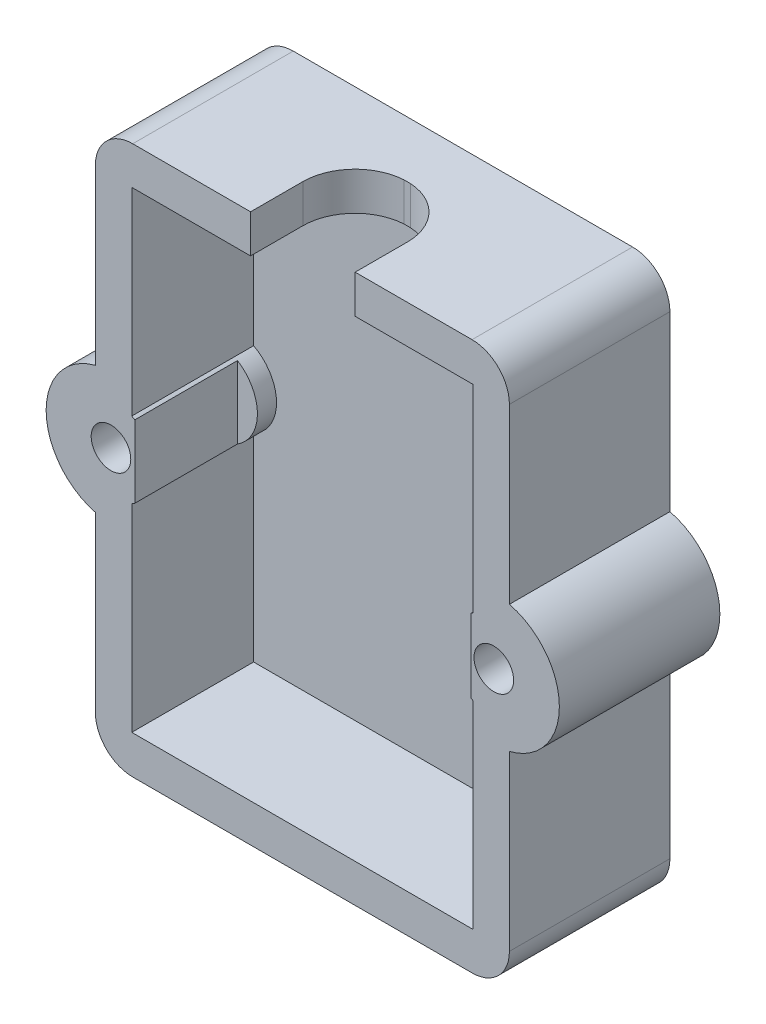
ISO-10303-21;
HEADER;
FILE_DESCRIPTION(('STEP AP214'),'2;1');
FILE_NAME('part.step','',(''),(''),'','','');
FILE_SCHEMA(('AUTOMOTIVE_DESIGN { 1 0 10303 214 1 1 1 1 }'));
ENDSEC;
DATA;
#1=APPLICATION_CONTEXT('core data for automotive mechanical design processes');
#2=APPLICATION_PROTOCOL_DEFINITION('international standard','automotive_design',2000,#1);
#3=PRODUCT_CONTEXT('',#1,'mechanical');
#4=PRODUCT('Part','Part','',(#3));
#5=PRODUCT_RELATED_PRODUCT_CATEGORY('part','',(#4));
#6=PRODUCT_DEFINITION_FORMATION('','',#4);
#7=PRODUCT_DEFINITION_CONTEXT('part definition',#1,'design');
#8=PRODUCT_DEFINITION('design','',#6,#7);
#9=PRODUCT_DEFINITION_SHAPE('','',#8);
#10=(LENGTH_UNIT() NAMED_UNIT(*) SI_UNIT(.MILLI.,.METRE.));
#11=(NAMED_UNIT(*) PLANE_ANGLE_UNIT() SI_UNIT($,.RADIAN.));
#12=(NAMED_UNIT(*) SI_UNIT($,.STERADIAN.) SOLID_ANGLE_UNIT());
#13=UNCERTAINTY_MEASURE_WITH_UNIT(LENGTH_MEASURE(1.E-05),#10,'distance_accuracy_value','');
#14=(GEOMETRIC_REPRESENTATION_CONTEXT(3) GLOBAL_UNCERTAINTY_ASSIGNED_CONTEXT((#13)) GLOBAL_UNIT_ASSIGNED_CONTEXT((#10,
#11,#12)) REPRESENTATION_CONTEXT('',''));
#15=CARTESIAN_POINT('',(0.,0.,0.));
#16=DIRECTION('',(0.,0.,1.));
#17=DIRECTION('',(1.,0.,0.));
#18=AXIS2_PLACEMENT_3D('',#15,#16,#17);
#19=CARTESIAN_POINT('',(-9.11000000000001,28.1835878256806,8.595));
#20=DIRECTION('',(0.,1.,0.));
#21=DIRECTION('',(-1.,0.,0.));
#22=AXIS2_PLACEMENT_3D('',#19,#20,#21);
#23=PLANE('',#22);
#24=CARTESIAN_POINT('',(0.,28.1835878256806,5.8));
#25=DIRECTION('',(0.,1.,0.));
#26=DIRECTION('',(0.,0.,1.));
#27=AXIS2_PLACEMENT_3D('',#24,#25,#26);
#28=CIRCLE('',#27,2.8);
#29=CARTESIAN_POINT('',(2.79999999999999,28.1835878256806,5.8));
#30=VERTEX_POINT('',#29);
#31=CARTESIAN_POINT('',(0.167257286836763,28.1835878256806,3.005));
#32=VERTEX_POINT('',#31);
#33=EDGE_CURVE('E437',#30,#32,#28,.T.);
#34=ORIENTED_EDGE('',*,*,#33,.F.);
#35=DIRECTION('',(0.,0.,1.));
#36=VECTOR('',#35,1.);
#37=CARTESIAN_POINT('',(2.79999999999999,28.1835878256806,0.));
#38=LINE('',#37,#36);
#39=CARTESIAN_POINT('',(2.79999999999999,28.1835878256806,8.595));
#40=VERTEX_POINT('',#39);
#41=EDGE_CURVE('E434',#30,#40,#38,.T.);
#42=ORIENTED_EDGE('',*,*,#41,.T.);
#43=DIRECTION('',(1.,0.,0.));
#44=VECTOR('',#43,1.);
#45=CARTESIAN_POINT('',(-9.11000000000001,28.1835878256806,8.595));
#46=LINE('',#45,#44);
#47=CARTESIAN_POINT('',(9.06,28.1835878256806,8.595));
#48=VERTEX_POINT('',#47);
#49=EDGE_CURVE('E313',#40,#48,#46,.T.);
#50=ORIENTED_EDGE('',*,*,#49,.T.);
#51=DIRECTION('',(0.,0.,-1.));
#52=VECTOR('',#51,1.);
#53=CARTESIAN_POINT('',(9.06,28.1835878256806,8.595));
#54=LINE('',#53,#52);
#55=CARTESIAN_POINT('',(9.06,28.1835878256806,0.));
#56=VERTEX_POINT('',#55);
#57=EDGE_CURVE('E398',#48,#56,#54,.T.);
#58=ORIENTED_EDGE('',*,*,#57,.T.);
#59=DIRECTION('',(1.,0.,0.));
#60=VECTOR('',#59,1.);
#61=CARTESIAN_POINT('',(-9.11000000000001,28.1835878256806,0.));
#62=LINE('',#61,#60);
#63=CARTESIAN_POINT('',(-9.11000000000001,28.1835878256806,0.));
#64=VERTEX_POINT('',#63);
#65=EDGE_CURVE('E346',#64,#56,#62,.T.);
#66=ORIENTED_EDGE('',*,*,#65,.F.);
#67=DIRECTION('',(0.,0.,-1.));
#68=VECTOR('',#67,1.);
#69=CARTESIAN_POINT('',(-9.11000000000001,28.1835878256806,8.595));
#70=LINE('',#69,#68);
#71=CARTESIAN_POINT('',(-9.11000000000001,28.1835878256806,8.595));
#72=VERTEX_POINT('',#71);
#73=EDGE_CURVE('E343',#72,#64,#70,.T.);
#74=ORIENTED_EDGE('',*,*,#73,.F.);
#75=CARTESIAN_POINT('',(-2.80000000000001,28.1835878256806,8.595));
#76=VERTEX_POINT('',#75);
#77=EDGE_CURVE('E315',#72,#76,#46,.T.);
#78=ORIENTED_EDGE('',*,*,#77,.T.);
#79=DIRECTION('',(0.,0.,1.));
#80=VECTOR('',#79,1.);
#81=CARTESIAN_POINT('',(-2.80000000000001,28.1835878256806,0.));
#82=LINE('',#81,#80);
#83=CARTESIAN_POINT('',(-2.80000000000001,28.1835878256806,5.8));
#84=VERTEX_POINT('',#83);
#85=EDGE_CURVE('E444',#84,#76,#82,.T.);
#86=ORIENTED_EDGE('',*,*,#85,.F.);
#87=CARTESIAN_POINT('',(-0.167257286836773,28.1835878256806,3.005));
#88=VERTEX_POINT('',#87);
#89=EDGE_CURVE('E441',#88,#84,#28,.T.);
#90=ORIENTED_EDGE('',*,*,#89,.F.);
#91=DIRECTION('',(1.,0.,0.));
#92=VECTOR('',#91,1.);
#93=CARTESIAN_POINT('',(0.,28.1835878256806,3.005));
#94=LINE('',#93,#92);
#95=EDGE_CURVE('E440',#88,#32,#94,.T.);
#96=ORIENTED_EDGE('',*,*,#95,.T.);
#97=EDGE_LOOP('',(#34,#42,#50,#58,#66,#74,#78,#86,#90,#96));
#98=FACE_BOUND('',#97,.T.);
#99=ADVANCED_FACE('F41',(#98),#23,.T.);
#100=CARTESIAN_POINT('',(-9.11000000000001,26.1835878256806,8.595));
#101=DIRECTION('',(0.,0.,-1.));
#102=DIRECTION('',(-1.,0.,0.));
#103=AXIS2_PLACEMENT_3D('',#100,#101,#102);
#104=PLANE('',#103);
#105=CARTESIAN_POINT('',(10.225,13.5,8.595));
#106=DIRECTION('',(0.,0.,1.));
#107=DIRECTION('',(-1.,0.,0.));
#108=AXIS2_PLACEMENT_3D('',#105,#106,#107);
#109=CIRCLE('',#108,1.06);
#110=CARTESIAN_POINT('',(9.165,13.5,8.595));
#111=VERTEX_POINT('',#110);
#112=EDGE_CURVE('E280',#111,#111,#109,.T.);
#113=ORIENTED_EDGE('',*,*,#112,.F.);
#114=EDGE_LOOP('',(#113));
#115=FACE_BOUND('',#114,.T.);
#116=CARTESIAN_POINT('',(-10.275,13.5,8.595));
#117=DIRECTION('',(0.,0.,1.));
#118=DIRECTION('',(1.,0.,0.));
#119=AXIS2_PLACEMENT_3D('',#116,#117,#118);
#120=CIRCLE('',#119,1.06);
#121=CARTESIAN_POINT('',(-9.21500000000001,13.5,8.595));
#122=VERTEX_POINT('',#121);
#123=EDGE_CURVE('E298',#122,#122,#120,.T.);
#124=ORIENTED_EDGE('',*,*,#123,.F.);
#125=EDGE_LOOP('',(#124));
#126=FACE_BOUND('',#125,.T.);
#127=CARTESIAN_POINT('',(10.175,13.5,8.595));
#128=DIRECTION('',(0.,0.,-1.));
#129=DIRECTION('',(-1.,0.,0.));
#130=AXIS2_PLACEMENT_3D('',#127,#128,#129);
#131=CIRCLE('',#130,2.28997905235349);
#132=CARTESIAN_POINT('',(9.,15.4655480305039,8.595));
#133=VERTEX_POINT('',#132);
#134=CARTESIAN_POINT('',(9.1125,15.528570385818,8.595));
#135=VERTEX_POINT('',#134);
#136=EDGE_CURVE('E255',#133,#135,#131,.T.);
#137=ORIENTED_EDGE('',*,*,#136,.F.);
#138=DIRECTION('',(0.,1.,0.));
#139=VECTOR('',#138,1.);
#140=CARTESIAN_POINT('',(9.,1.22331959556489,8.595));
#141=LINE('',#140,#139);
#142=CARTESIAN_POINT('',(9.,11.5344519694961,8.595));
#143=VERTEX_POINT('',#142);
#144=EDGE_CURVE('E240',#143,#133,#141,.T.);
#145=ORIENTED_EDGE('',*,*,#144,.F.);
#146=CARTESIAN_POINT('',(9.1125,11.471429614182,8.595));
#147=VERTEX_POINT('',#146);
#148=EDGE_CURVE('E253',#147,#143,#131,.T.);
#149=ORIENTED_EDGE('',*,*,#148,.F.);
#150=DIRECTION('',(0.,1.,0.));
#151=VECTOR('',#150,1.);
#152=CARTESIAN_POINT('',(9.1125,0.861412174319438,8.595));
#153=LINE('',#152,#151);
#154=CARTESIAN_POINT('',(9.1125,0.861412174319438,8.595));
#155=VERTEX_POINT('',#154);
#156=EDGE_CURVE('E267',#155,#147,#153,.T.);
#157=ORIENTED_EDGE('',*,*,#156,.F.);
#158=DIRECTION('',(1.,0.,0.));
#159=VECTOR('',#158,1.);
#160=CARTESIAN_POINT('',(-9.1625,0.861412174319438,8.595));
#161=LINE('',#160,#159);
#162=CARTESIAN_POINT('',(-9.1625,0.861412174319438,8.595));
#163=VERTEX_POINT('',#162);
#164=EDGE_CURVE('E487',#163,#155,#161,.T.);
#165=ORIENTED_EDGE('',*,*,#164,.F.);
#166=DIRECTION('',(0.,-1.,0.));
#167=VECTOR('',#166,1.);
#168=CARTESIAN_POINT('',(-9.1625,0.861412174319438,8.595));
#169=LINE('',#168,#167);
#170=CARTESIAN_POINT('',(-9.1625,11.471429614182,8.595));
#171=VERTEX_POINT('',#170);
#172=EDGE_CURVE('E485',#171,#163,#169,.T.);
#173=ORIENTED_EDGE('',*,*,#172,.F.);
#174=CARTESIAN_POINT('',(-10.225,13.5,8.595));
#175=DIRECTION('',(0.,0.,-1.));
#176=DIRECTION('',(1.,0.,0.));
#177=AXIS2_PLACEMENT_3D('',#174,#175,#176);
#178=CIRCLE('',#177,2.28997905235349);
#179=CARTESIAN_POINT('',(-9.,11.565218601439,8.595));
#180=VERTEX_POINT('',#179);
#181=EDGE_CURVE('E416',#180,#171,#178,.T.);
#182=ORIENTED_EDGE('',*,*,#181,.F.);
#183=DIRECTION('',(0.,-1.,0.));
#184=VECTOR('',#183,1.);
#185=CARTESIAN_POINT('',(-9.,1.22331959556489,8.595));
#186=LINE('',#185,#184);
#187=CARTESIAN_POINT('',(-9.,15.434781398561,8.595));
#188=VERTEX_POINT('',#187);
#189=EDGE_CURVE('E256',#188,#180,#186,.T.);
#190=ORIENTED_EDGE('',*,*,#189,.F.);
#191=CARTESIAN_POINT('',(-9.1625,15.528570385818,8.595));
#192=VERTEX_POINT('',#191);
#193=EDGE_CURVE('E409',#192,#188,#178,.T.);
#194=ORIENTED_EDGE('',*,*,#193,.F.);
#195=DIRECTION('',(0.,-1.,0.));
#196=VECTOR('',#195,1.);
#197=CARTESIAN_POINT('',(-9.1625,15.528570385818,8.595));
#198=LINE('',#197,#196);
#199=CARTESIAN_POINT('',(-9.1625,26.1364121743194,8.595));
#200=VERTEX_POINT('',#199);
#201=EDGE_CURVE('E274',#200,#192,#198,.T.);
#202=ORIENTED_EDGE('',*,*,#201,.F.);
#203=DIRECTION('',(-1.,0.,0.));
#204=VECTOR('',#203,1.);
#205=CARTESIAN_POINT('',(-9.1625,26.1364121743194,8.595));
#206=LINE('',#205,#204);
#207=CARTESIAN_POINT('',(-2.80000000000001,26.1364121743194,8.595));
#208=VERTEX_POINT('',#207);
#209=EDGE_CURVE('E265',#208,#200,#206,.T.);
#210=ORIENTED_EDGE('',*,*,#209,.F.);
#211=DIRECTION('',(0.,1.,0.));
#212=VECTOR('',#211,1.);
#213=CARTESIAN_POINT('',(-2.80000000000001,-1.18458782568056,8.595));
#214=LINE('',#213,#212);
#215=EDGE_CURVE('E450',#208,#76,#214,.T.);
#216=ORIENTED_EDGE('',*,*,#215,.T.);
#217=ORIENTED_EDGE('',*,*,#77,.F.);
#218=CARTESIAN_POINT('',(-9.11000000000001,26.1835878256806,8.595));
#219=DIRECTION('',(0.,0.,-1.));
#220=DIRECTION('',(-1.,0.,0.));
#221=AXIS2_PLACEMENT_3D('',#218,#219,#220);
#222=CIRCLE('',#221,2.);
#223=CARTESIAN_POINT('',(-11.11,26.1835878256806,8.595));
#224=VERTEX_POINT('',#223);
#225=EDGE_CURVE('E310',#224,#72,#222,.T.);
#226=ORIENTED_EDGE('',*,*,#225,.F.);
#227=DIRECTION('',(0.,1.,0.));
#228=VECTOR('',#227,1.);
#229=CARTESIAN_POINT('',(-11.11,16.9092337848848,8.595));
#230=LINE('',#229,#228);
#231=CARTESIAN_POINT('',(-11.11,16.9092337848848,8.595));
#232=VERTEX_POINT('',#231);
#233=EDGE_CURVE('E340',#232,#224,#230,.T.);
#234=ORIENTED_EDGE('',*,*,#233,.F.);
#235=CARTESIAN_POINT('',(-10.225,13.5,8.595));
#236=DIRECTION('',(0.,0.,1.));
#237=DIRECTION('',(1.,0.,0.));
#238=AXIS2_PLACEMENT_3D('',#235,#236,#237);
#239=CIRCLE('',#238,3.52222940763375);
#240=CARTESIAN_POINT('',(-11.11,10.0907662151152,8.595));
#241=VERTEX_POINT('',#240);
#242=EDGE_CURVE('E338',#232,#241,#239,.T.);
#243=ORIENTED_EDGE('',*,*,#242,.T.);
#244=DIRECTION('',(0.,1.,0.));
#245=VECTOR('',#244,1.);
#246=CARTESIAN_POINT('',(-11.11,0.816412174319438,8.595));
#247=LINE('',#246,#245);
#248=CARTESIAN_POINT('',(-11.11,0.816412174319438,8.595));
#249=VERTEX_POINT('',#248);
#250=EDGE_CURVE('E335',#249,#241,#247,.T.);
#251=ORIENTED_EDGE('',*,*,#250,.F.);
#252=CARTESIAN_POINT('',(-9.11,0.816412174319438,8.595));
#253=DIRECTION('',(0.,0.,1.));
#254=DIRECTION('',(1.,0.,0.));
#255=AXIS2_PLACEMENT_3D('',#252,#253,#254);
#256=CIRCLE('',#255,2.);
#257=CARTESIAN_POINT('',(-9.11,-1.18358782568056,8.595));
#258=VERTEX_POINT('',#257);
#259=EDGE_CURVE('E333',#249,#258,#256,.T.);
#260=ORIENTED_EDGE('',*,*,#259,.T.);
#261=DIRECTION('',(1.,0.,0.));
#262=VECTOR('',#261,1.);
#263=CARTESIAN_POINT('',(-9.11,-1.18358782568056,8.595));
#264=LINE('',#263,#262);
#265=CARTESIAN_POINT('',(9.06,-1.18358782568056,8.595));
#266=VERTEX_POINT('',#265);
#267=EDGE_CURVE('E331',#258,#266,#264,.T.);
#268=ORIENTED_EDGE('',*,*,#267,.T.);
#269=CARTESIAN_POINT('',(9.06,0.816412174319441,8.595));
#270=DIRECTION('',(0.,0.,-1.));
#271=DIRECTION('',(-1.,0.,0.));
#272=AXIS2_PLACEMENT_3D('',#269,#270,#271);
#273=CIRCLE('',#272,2.);
#274=CARTESIAN_POINT('',(11.06,0.816412174319441,8.595));
#275=VERTEX_POINT('',#274);
#276=EDGE_CURVE('E328',#275,#266,#273,.T.);
#277=ORIENTED_EDGE('',*,*,#276,.F.);
#278=DIRECTION('',(0.,1.,0.));
#279=VECTOR('',#278,1.);
#280=CARTESIAN_POINT('',(11.06,0.816412174319441,8.595));
#281=LINE('',#280,#279);
#282=CARTESIAN_POINT('',(11.06,10.0907662151152,8.595));
#283=VERTEX_POINT('',#282);
#284=EDGE_CURVE('E326',#275,#283,#281,.T.);
#285=ORIENTED_EDGE('',*,*,#284,.T.);
#286=CARTESIAN_POINT('',(10.225,13.5,8.595));
#287=DIRECTION('',(0.,0.,-1.));
#288=DIRECTION('',(-1.,0.,0.));
#289=AXIS2_PLACEMENT_3D('',#286,#287,#288);
#290=CIRCLE('',#289,3.51000000000001);
#291=CARTESIAN_POINT('',(11.06,16.9092337848848,8.595));
#292=VERTEX_POINT('',#291);
#293=EDGE_CURVE('E323',#292,#283,#290,.T.);
#294=ORIENTED_EDGE('',*,*,#293,.F.);
#295=DIRECTION('',(0.,1.,0.));
#296=VECTOR('',#295,1.);
#297=CARTESIAN_POINT('',(11.06,16.9092337848848,8.595));
#298=LINE('',#297,#296);
#299=CARTESIAN_POINT('',(11.06,26.1835878256806,8.595));
#300=VERTEX_POINT('',#299);
#301=EDGE_CURVE('E321',#292,#300,#298,.T.);
#302=ORIENTED_EDGE('',*,*,#301,.T.);
#303=CARTESIAN_POINT('',(9.06,26.1835878256806,8.595));
#304=DIRECTION('',(0.,0.,-1.));
#305=DIRECTION('',(-1.,0.,0.));
#306=AXIS2_PLACEMENT_3D('',#303,#304,#305);
#307=CIRCLE('',#306,2.);
#308=EDGE_CURVE('E318',#48,#300,#307,.T.);
#309=ORIENTED_EDGE('',*,*,#308,.F.);
#310=ORIENTED_EDGE('',*,*,#49,.F.);
#311=DIRECTION('',(0.,1.,0.));
#312=VECTOR('',#311,1.);
#313=CARTESIAN_POINT('',(2.79999999999999,-1.18458782568056,8.595));
#314=LINE('',#313,#312);
#315=CARTESIAN_POINT('',(2.79999999999999,26.1364121743194,8.595));
#316=VERTEX_POINT('',#315);
#317=EDGE_CURVE('E447',#316,#40,#314,.T.);
#318=ORIENTED_EDGE('',*,*,#317,.F.);
#319=CARTESIAN_POINT('',(9.1125,26.1364121743194,8.595));
#320=VERTEX_POINT('',#319);
#321=EDGE_CURVE('E271',#320,#316,#206,.T.);
#322=ORIENTED_EDGE('',*,*,#321,.F.);
#323=DIRECTION('',(0.,1.,0.));
#324=VECTOR('',#323,1.);
#325=CARTESIAN_POINT('',(9.1125,15.528570385818,8.595));
#326=LINE('',#325,#324);
#327=EDGE_CURVE('E262',#135,#320,#326,.T.);
#328=ORIENTED_EDGE('',*,*,#327,.F.);
#329=EDGE_LOOP('',(#137,#145,#149,#157,#165,#173,#182,#190,#194,#202,#210,#216,#217,#226,#234,
#243,#251,#260,#268,#277,#285,#294,#302,#309,#310,#318,#322,#328));
#330=FACE_BOUND('',#329,.T.);
#331=ADVANCED_FACE('F251',(#115,#126,#330),#104,.F.);
#332=CARTESIAN_POINT('',(-9.1625,26.1364121743194,2.07));
#333=DIRECTION('',(0.,1.,0.));
#334=DIRECTION('',(0.,0.,1.));
#335=AXIS2_PLACEMENT_3D('',#332,#333,#334);
#336=PLANE('',#335);
#337=DIRECTION('',(0.,0.,-1.));
#338=VECTOR('',#337,1.);
#339=CARTESIAN_POINT('',(2.79999999999999,26.1364121743194,0.));
#340=LINE('',#339,#338);
#341=CARTESIAN_POINT('',(2.79999999999999,26.1364121743194,5.8));
#342=VERTEX_POINT('',#341);
#343=EDGE_CURVE('E431',#316,#342,#340,.T.);
#344=ORIENTED_EDGE('',*,*,#343,.T.);
#345=CARTESIAN_POINT('',(0.,26.1364121743194,5.8));
#346=DIRECTION('',(0.,1.,0.));
#347=DIRECTION('',(0.,0.,1.));
#348=AXIS2_PLACEMENT_3D('',#345,#346,#347);
#349=CIRCLE('',#348,2.8);
#350=CARTESIAN_POINT('',(0.167257286836763,26.1364121743194,3.005));
#351=VERTEX_POINT('',#350);
#352=EDGE_CURVE('E449',#351,#342,#349,.F.);
#353=ORIENTED_EDGE('',*,*,#352,.F.);
#354=DIRECTION('',(-1.,0.,0.));
#355=VECTOR('',#354,1.);
#356=CARTESIAN_POINT('',(0.,26.1364121743194,3.005));
#357=LINE('',#356,#355);
#358=CARTESIAN_POINT('',(-0.167257286836773,26.1364121743194,3.005));
#359=VERTEX_POINT('',#358);
#360=EDGE_CURVE('E422',#351,#359,#357,.T.);
#361=ORIENTED_EDGE('',*,*,#360,.T.);
#362=CARTESIAN_POINT('',(0.,26.1364121743194,5.8));
#363=DIRECTION('',(0.,1.,0.));
#364=DIRECTION('',(0.,0.,1.));
#365=AXIS2_PLACEMENT_3D('',#362,#363,#364);
#366=CIRCLE('',#365,2.8);
#367=CARTESIAN_POINT('',(-2.80000000000001,26.1364121743194,5.8));
#368=VERTEX_POINT('',#367);
#369=EDGE_CURVE('E425',#368,#359,#366,.F.);
#370=ORIENTED_EDGE('',*,*,#369,.F.);
#371=DIRECTION('',(0.,0.,-1.));
#372=VECTOR('',#371,1.);
#373=CARTESIAN_POINT('',(-2.80000000000001,26.1364121743194,0.));
#374=LINE('',#373,#372);
#375=EDGE_CURVE('E428',#208,#368,#374,.T.);
#376=ORIENTED_EDGE('',*,*,#375,.F.);
#377=ORIENTED_EDGE('',*,*,#209,.T.);
#378=DIRECTION('',(0.,0.,1.));
#379=VECTOR('',#378,1.);
#380=CARTESIAN_POINT('',(-9.1625,26.1364121743194,2.07));
#381=LINE('',#380,#379);
#382=CARTESIAN_POINT('',(-9.1625,26.1364121743194,2.07));
#383=VERTEX_POINT('',#382);
#384=EDGE_CURVE('E281',#383,#200,#381,.T.);
#385=ORIENTED_EDGE('',*,*,#384,.F.);
#386=DIRECTION('',(-1.,0.,0.));
#387=VECTOR('',#386,1.);
#388=CARTESIAN_POINT('',(-9.1625,26.1364121743194,2.07));
#389=LINE('',#388,#387);
#390=CARTESIAN_POINT('',(9.1125,26.1364121743194,2.07));
#391=VERTEX_POINT('',#390);
#392=EDGE_CURVE('E479',#391,#383,#389,.T.);
#393=ORIENTED_EDGE('',*,*,#392,.F.);
#394=DIRECTION('',(0.,0.,1.));
#395=VECTOR('',#394,1.);
#396=CARTESIAN_POINT('',(9.1125,26.1364121743194,2.07));
#397=LINE('',#396,#395);
#398=EDGE_CURVE('E284',#391,#320,#397,.T.);
#399=ORIENTED_EDGE('',*,*,#398,.T.);
#400=ORIENTED_EDGE('',*,*,#321,.T.);
#401=EDGE_LOOP('',(#344,#353,#361,#370,#376,#377,#385,#393,#399,#400));
#402=FACE_BOUND('',#401,.T.);
#403=ADVANCED_FACE('F509',(#402),#336,.F.);
#404=CARTESIAN_POINT('',(-9.11000000000001,26.1835878256806,8.595));
#405=DIRECTION('',(0.,0.,-1.));
#406=DIRECTION('',(-1.,0.,0.));
#407=AXIS2_PLACEMENT_3D('',#404,#405,#406);
#408=CYLINDRICAL_SURFACE('',#407,2.);
#409=CARTESIAN_POINT('',(-9.11000000000001,26.1835878256806,0.));
#410=DIRECTION('',(0.,0.,-1.));
#411=DIRECTION('',(-1.,0.,0.));
#412=AXIS2_PLACEMENT_3D('',#409,#410,#411);
#413=CIRCLE('',#412,2.);
#414=CARTESIAN_POINT('',(-11.11,26.1835878256806,0.));
#415=VERTEX_POINT('',#414);
#416=EDGE_CURVE('E301',#415,#64,#413,.T.);
#417=ORIENTED_EDGE('',*,*,#416,.F.);
#418=DIRECTION('',(0.,0.,-1.));
#419=VECTOR('',#418,1.);
#420=CARTESIAN_POINT('',(-11.11,26.1835878256806,8.595));
#421=LINE('',#420,#419);
#422=EDGE_CURVE('E377',#224,#415,#421,.T.);
#423=ORIENTED_EDGE('',*,*,#422,.F.);
#424=ORIENTED_EDGE('',*,*,#225,.T.);
#425=ORIENTED_EDGE('',*,*,#73,.T.);
#426=EDGE_LOOP('',(#417,#423,#424,#425));
#427=FACE_BOUND('',#426,.T.);
#428=ADVANCED_FACE('F43',(#427),#408,.T.);
#429=CARTESIAN_POINT('',(-11.11,16.9092337848848,8.595));
#430=DIRECTION('',(-1.,0.,0.));
#431=DIRECTION('',(0.,-1.,0.));
#432=AXIS2_PLACEMENT_3D('',#429,#430,#431);
#433=PLANE('',#432);
#434=DIRECTION('',(0.,1.,0.));
#435=VECTOR('',#434,1.);
#436=CARTESIAN_POINT('',(-11.11,16.9092337848848,0.));
#437=LINE('',#436,#435);
#438=CARTESIAN_POINT('',(-11.11,16.9092337848848,0.));
#439=VERTEX_POINT('',#438);
#440=EDGE_CURVE('E314',#439,#415,#437,.T.);
#441=ORIENTED_EDGE('',*,*,#440,.F.);
#442=DIRECTION('',(0.,0.,-1.));
#443=VECTOR('',#442,1.);
#444=CARTESIAN_POINT('',(-11.11,16.9092337848848,8.595));
#445=LINE('',#444,#443);
#446=EDGE_CURVE('E379',#232,#439,#445,.T.);
#447=ORIENTED_EDGE('',*,*,#446,.F.);
#448=ORIENTED_EDGE('',*,*,#233,.T.);
#449=ORIENTED_EDGE('',*,*,#422,.T.);
#450=EDGE_LOOP('',(#441,#447,#448,#449));
#451=FACE_BOUND('',#450,.T.);
#452=ADVANCED_FACE('F525',(#451),#433,.T.);
#453=CARTESIAN_POINT('',(-10.225,13.5,8.595));
#454=DIRECTION('',(0.,0.,-1.));
#455=DIRECTION('',(-1.,0.,0.));
#456=AXIS2_PLACEMENT_3D('',#453,#454,#455);
#457=CYLINDRICAL_SURFACE('',#456,3.52222940763375);
#458=CARTESIAN_POINT('',(-10.225,13.5,0.));
#459=DIRECTION('',(0.,0.,1.));
#460=DIRECTION('',(1.,0.,0.));
#461=AXIS2_PLACEMENT_3D('',#458,#459,#460);
#462=CIRCLE('',#461,3.52222940763375);
#463=CARTESIAN_POINT('',(-11.11,10.0907662151152,0.));
#464=VERTEX_POINT('',#463);
#465=EDGE_CURVE('E372',#439,#464,#462,.T.);
#466=ORIENTED_EDGE('',*,*,#465,.T.);
#467=DIRECTION('',(0.,0.,-1.));
#468=VECTOR('',#467,1.);
#469=CARTESIAN_POINT('',(-11.11,10.0907662151152,8.595));
#470=LINE('',#469,#468);
#471=EDGE_CURVE('E381',#241,#464,#470,.T.);
#472=ORIENTED_EDGE('',*,*,#471,.F.);
#473=ORIENTED_EDGE('',*,*,#242,.F.);
#474=ORIENTED_EDGE('',*,*,#446,.T.);
#475=EDGE_LOOP('',(#466,#472,#473,#474));
#476=FACE_BOUND('',#475,.T.);
#477=ADVANCED_FACE('F530',(#476),#457,.T.);
#478=CARTESIAN_POINT('',(-11.11,0.816412174319438,8.595));
#479=DIRECTION('',(-1.,0.,0.));
#480=DIRECTION('',(0.,-1.,0.));
#481=AXIS2_PLACEMENT_3D('',#478,#479,#480);
#482=PLANE('',#481);
#483=DIRECTION('',(0.,1.,0.));
#484=VECTOR('',#483,1.);
#485=CARTESIAN_POINT('',(-11.11,0.816412174319438,0.));
#486=LINE('',#485,#484);
#487=CARTESIAN_POINT('',(-11.11,0.816412174319438,0.));
#488=VERTEX_POINT('',#487);
#489=EDGE_CURVE('E369',#488,#464,#486,.T.);
#490=ORIENTED_EDGE('',*,*,#489,.F.);
#491=DIRECTION('',(0.,0.,-1.));
#492=VECTOR('',#491,1.);
#493=CARTESIAN_POINT('',(-11.11,0.816412174319438,8.595));
#494=LINE('',#493,#492);
#495=EDGE_CURVE('E383',#249,#488,#494,.T.);
#496=ORIENTED_EDGE('',*,*,#495,.F.);
#497=ORIENTED_EDGE('',*,*,#250,.T.);
#498=ORIENTED_EDGE('',*,*,#471,.T.);
#499=EDGE_LOOP('',(#490,#496,#497,#498));
#500=FACE_BOUND('',#499,.T.);
#501=ADVANCED_FACE('F534',(#500),#482,.T.);
#502=CARTESIAN_POINT('',(-9.11,0.816412174319438,8.595));
#503=DIRECTION('',(0.,0.,-1.));
#504=DIRECTION('',(-1.,0.,0.));
#505=AXIS2_PLACEMENT_3D('',#502,#503,#504);
#506=CYLINDRICAL_SURFACE('',#505,2.);
#507=CARTESIAN_POINT('',(-9.11,0.816412174319438,0.));
#508=DIRECTION('',(0.,0.,1.));
#509=DIRECTION('',(1.,0.,0.));
#510=AXIS2_PLACEMENT_3D('',#507,#508,#509);
#511=CIRCLE('',#510,2.);
#512=CARTESIAN_POINT('',(-9.11,-1.18358782568056,0.));
#513=VERTEX_POINT('',#512);
#514=EDGE_CURVE('E367',#488,#513,#511,.T.);
#515=ORIENTED_EDGE('',*,*,#514,.T.);
#516=DIRECTION('',(0.,0.,-1.));
#517=VECTOR('',#516,1.);
#518=CARTESIAN_POINT('',(-9.11,-1.18358782568056,8.595));
#519=LINE('',#518,#517);
#520=EDGE_CURVE('E385',#258,#513,#519,.T.);
#521=ORIENTED_EDGE('',*,*,#520,.F.);
#522=ORIENTED_EDGE('',*,*,#259,.F.);
#523=ORIENTED_EDGE('',*,*,#495,.T.);
#524=EDGE_LOOP('',(#515,#521,#522,#523));
#525=FACE_BOUND('',#524,.T.);
#526=ADVANCED_FACE('F539',(#525),#506,.T.);
#527=CARTESIAN_POINT('',(-9.11,-1.18358782568056,8.595));
#528=DIRECTION('',(0.,1.,0.));
#529=DIRECTION('',(-1.,0.,0.));
#530=AXIS2_PLACEMENT_3D('',#527,#528,#529);
#531=PLANE('',#530);
#532=DIRECTION('',(1.,0.,0.));
#533=VECTOR('',#532,1.);
#534=CARTESIAN_POINT('',(-9.11,-1.18358782568056,0.));
#535=LINE('',#534,#533);
#536=CARTESIAN_POINT('',(9.06,-1.18358782568056,0.));
#537=VERTEX_POINT('',#536);
#538=EDGE_CURVE('E364',#513,#537,#535,.T.);
#539=ORIENTED_EDGE('',*,*,#538,.T.);
#540=DIRECTION('',(0.,0.,-1.));
#541=VECTOR('',#540,1.);
#542=CARTESIAN_POINT('',(9.06,-1.18358782568056,8.595));
#543=LINE('',#542,#541);
#544=EDGE_CURVE('E388',#266,#537,#543,.T.);
#545=ORIENTED_EDGE('',*,*,#544,.F.);
#546=ORIENTED_EDGE('',*,*,#267,.F.);
#547=ORIENTED_EDGE('',*,*,#520,.T.);
#548=EDGE_LOOP('',(#539,#545,#546,#547));
#549=FACE_BOUND('',#548,.T.);
#550=ADVANCED_FACE('F544',(#549),#531,.F.);
#551=CARTESIAN_POINT('',(9.06,0.816412174319441,8.595));
#552=DIRECTION('',(0.,0.,-1.));
#553=DIRECTION('',(-1.,0.,0.));
#554=AXIS2_PLACEMENT_3D('',#551,#552,#553);
#555=CYLINDRICAL_SURFACE('',#554,2.);
#556=CARTESIAN_POINT('',(9.06,0.816412174319441,0.));
#557=DIRECTION('',(0.,0.,-1.));
#558=DIRECTION('',(-1.,0.,0.));
#559=AXIS2_PLACEMENT_3D('',#556,#557,#558);
#560=CIRCLE('',#559,2.);
#561=CARTESIAN_POINT('',(11.06,0.816412174319441,0.));
#562=VERTEX_POINT('',#561);
#563=EDGE_CURVE('E361',#562,#537,#560,.T.);
#564=ORIENTED_EDGE('',*,*,#563,.F.);
#565=DIRECTION('',(0.,0.,-1.));
#566=VECTOR('',#565,1.);
#567=CARTESIAN_POINT('',(11.06,0.816412174319441,8.595));
#568=LINE('',#567,#566);
#569=EDGE_CURVE('E390',#275,#562,#568,.T.);
#570=ORIENTED_EDGE('',*,*,#569,.F.);
#571=ORIENTED_EDGE('',*,*,#276,.T.);
#572=ORIENTED_EDGE('',*,*,#544,.T.);
#573=EDGE_LOOP('',(#564,#570,#571,#572));
#574=FACE_BOUND('',#573,.T.);
#575=ADVANCED_FACE('F548',(#574),#555,.T.);
#576=CARTESIAN_POINT('',(11.06,0.816412174319441,8.595));
#577=DIRECTION('',(-1.,0.,0.));
#578=DIRECTION('',(0.,-1.,0.));
#579=AXIS2_PLACEMENT_3D('',#576,#577,#578);
#580=PLANE('',#579);
#581=DIRECTION('',(0.,1.,0.));
#582=VECTOR('',#581,1.);
#583=CARTESIAN_POINT('',(11.06,0.816412174319441,0.));
#584=LINE('',#583,#582);
#585=CARTESIAN_POINT('',(11.06,10.0907662151152,0.));
#586=VERTEX_POINT('',#585);
#587=EDGE_CURVE('E358',#562,#586,#584,.T.);
#588=ORIENTED_EDGE('',*,*,#587,.T.);
#589=DIRECTION('',(0.,0.,-1.));
#590=VECTOR('',#589,1.);
#591=CARTESIAN_POINT('',(11.06,10.0907662151152,8.595));
#592=LINE('',#591,#590);
#593=EDGE_CURVE('E392',#283,#586,#592,.T.);
#594=ORIENTED_EDGE('',*,*,#593,.F.);
#595=ORIENTED_EDGE('',*,*,#284,.F.);
#596=ORIENTED_EDGE('',*,*,#569,.T.);
#597=EDGE_LOOP('',(#588,#594,#595,#596));
#598=FACE_BOUND('',#597,.T.);
#599=ADVANCED_FACE('F553',(#598),#580,.F.);
#600=CARTESIAN_POINT('',(10.225,13.5,8.595));
#601=DIRECTION('',(0.,0.,-1.));
#602=DIRECTION('',(-1.,0.,0.));
#603=AXIS2_PLACEMENT_3D('',#600,#601,#602);
#604=CYLINDRICAL_SURFACE('',#603,3.51000000000001);
#605=CARTESIAN_POINT('',(10.225,13.5,0.));
#606=DIRECTION('',(0.,0.,-1.));
#607=DIRECTION('',(-1.,0.,0.));
#608=AXIS2_PLACEMENT_3D('',#605,#606,#607);
#609=CIRCLE('',#608,3.51000000000001);
#610=CARTESIAN_POINT('',(11.06,16.9092337848848,0.));
#611=VERTEX_POINT('',#610);
#612=EDGE_CURVE('E355',#611,#586,#609,.T.);
#613=ORIENTED_EDGE('',*,*,#612,.F.);
#614=DIRECTION('',(0.,0.,-1.));
#615=VECTOR('',#614,1.);
#616=CARTESIAN_POINT('',(11.06,16.9092337848848,8.595));
#617=LINE('',#616,#615);
#618=EDGE_CURVE('E394',#292,#611,#617,.T.);
#619=ORIENTED_EDGE('',*,*,#618,.F.);
#620=ORIENTED_EDGE('',*,*,#293,.T.);
#621=ORIENTED_EDGE('',*,*,#593,.T.);
#622=EDGE_LOOP('',(#613,#619,#620,#621));
#623=FACE_BOUND('',#622,.T.);
#624=ADVANCED_FACE('F560',(#623),#604,.T.);
#625=CARTESIAN_POINT('',(11.06,16.9092337848848,8.595));
#626=DIRECTION('',(-1.,0.,0.));
#627=DIRECTION('',(0.,-1.,0.));
#628=AXIS2_PLACEMENT_3D('',#625,#626,#627);
#629=PLANE('',#628);
#630=DIRECTION('',(0.,1.,0.));
#631=VECTOR('',#630,1.);
#632=CARTESIAN_POINT('',(11.06,16.9092337848848,0.));
#633=LINE('',#632,#631);
#634=CARTESIAN_POINT('',(11.06,26.1835878256806,0.));
#635=VERTEX_POINT('',#634);
#636=EDGE_CURVE('E352',#611,#635,#633,.T.);
#637=ORIENTED_EDGE('',*,*,#636,.T.);
#638=DIRECTION('',(0.,0.,-1.));
#639=VECTOR('',#638,1.);
#640=CARTESIAN_POINT('',(11.06,26.1835878256806,8.595));
#641=LINE('',#640,#639);
#642=EDGE_CURVE('E396',#300,#635,#641,.T.);
#643=ORIENTED_EDGE('',*,*,#642,.F.);
#644=ORIENTED_EDGE('',*,*,#301,.F.);
#645=ORIENTED_EDGE('',*,*,#618,.T.);
#646=EDGE_LOOP('',(#637,#643,#644,#645));
#647=FACE_BOUND('',#646,.T.);
#648=ADVANCED_FACE('F563',(#647),#629,.F.);
#649=CARTESIAN_POINT('',(9.06,26.1835878256806,8.595));
#650=DIRECTION('',(0.,0.,-1.));
#651=DIRECTION('',(-1.,0.,0.));
#652=AXIS2_PLACEMENT_3D('',#649,#650,#651);
#653=CYLINDRICAL_SURFACE('',#652,2.);
#654=CARTESIAN_POINT('',(9.06,26.1835878256806,0.));
#655=DIRECTION('',(0.,0.,-1.));
#656=DIRECTION('',(-1.,0.,0.));
#657=AXIS2_PLACEMENT_3D('',#654,#655,#656);
#658=CIRCLE('',#657,2.);
#659=EDGE_CURVE('E349',#56,#635,#658,.T.);
#660=ORIENTED_EDGE('',*,*,#659,.F.);
#661=ORIENTED_EDGE('',*,*,#57,.F.);
#662=ORIENTED_EDGE('',*,*,#308,.T.);
#663=ORIENTED_EDGE('',*,*,#642,.T.);
#664=EDGE_LOOP('',(#660,#661,#662,#663));
#665=FACE_BOUND('',#664,.T.);
#666=ADVANCED_FACE('F567',(#665),#653,.T.);
#667=CARTESIAN_POINT('',(-9.11000000000001,26.1835878256806,0.));
#668=DIRECTION('',(0.,0.,-1.));
#669=DIRECTION('',(-1.,0.,0.));
#670=AXIS2_PLACEMENT_3D('',#667,#668,#669);
#671=PLANE('',#670);
#672=CARTESIAN_POINT('',(-10.275,13.5,0.));
#673=DIRECTION('',(0.,0.,-1.));
#674=DIRECTION('',(-1.,0.,0.));
#675=AXIS2_PLACEMENT_3D('',#672,#673,#674);
#676=CIRCLE('',#675,1.06);
#677=CARTESIAN_POINT('',(-11.335,13.5,0.));
#678=VERTEX_POINT('',#677);
#679=EDGE_CURVE('E302',#678,#678,#676,.F.);
#680=ORIENTED_EDGE('',*,*,#679,.T.);
#681=EDGE_LOOP('',(#680));
#682=FACE_BOUND('',#681,.T.);
#683=CARTESIAN_POINT('',(10.225,13.5,0.));
#684=DIRECTION('',(0.,0.,-1.));
#685=DIRECTION('',(-1.,0.,0.));
#686=AXIS2_PLACEMENT_3D('',#683,#684,#685);
#687=CIRCLE('',#686,1.06);
#688=CARTESIAN_POINT('',(9.165,13.5,0.));
#689=VERTEX_POINT('',#688);
#690=EDGE_CURVE('E305',#689,#689,#687,.F.);
#691=ORIENTED_EDGE('',*,*,#690,.T.);
#692=EDGE_LOOP('',(#691));
#693=FACE_BOUND('',#692,.T.);
#694=ORIENTED_EDGE('',*,*,#416,.T.);
#695=ORIENTED_EDGE('',*,*,#65,.T.);
#696=ORIENTED_EDGE('',*,*,#659,.T.);
#697=ORIENTED_EDGE('',*,*,#636,.F.);
#698=ORIENTED_EDGE('',*,*,#612,.T.);
#699=ORIENTED_EDGE('',*,*,#587,.F.);
#700=ORIENTED_EDGE('',*,*,#563,.T.);
#701=ORIENTED_EDGE('',*,*,#538,.F.);
#702=ORIENTED_EDGE('',*,*,#514,.F.);
#703=ORIENTED_EDGE('',*,*,#489,.T.);
#704=ORIENTED_EDGE('',*,*,#465,.F.);
#705=ORIENTED_EDGE('',*,*,#440,.T.);
#706=EDGE_LOOP('',(#694,#695,#696,#697,#698,#699,#700,#701,#702,#703,#704,#705));
#707=FACE_BOUND('',#706,.T.);
#708=ADVANCED_FACE('F606',(#682,#693,#707),#671,.T.);
#709=CARTESIAN_POINT('',(10.225,13.5,-0.000999999999999265));
#710=DIRECTION('',(0.,0.,1.));
#711=DIRECTION('',(1.,0.,0.));
#712=AXIS2_PLACEMENT_3D('',#709,#710,#711);
#713=CYLINDRICAL_SURFACE('',#712,1.06);
#714=ORIENTED_EDGE('',*,*,#690,.F.);
#715=EDGE_LOOP('',(#714));
#716=FACE_BOUND('',#715,.T.);
#717=ORIENTED_EDGE('',*,*,#112,.T.);
#718=EDGE_LOOP('',(#717));
#719=FACE_BOUND('',#718,.T.);
#720=ADVANCED_FACE('F626',(#716,#719),#713,.F.);
#721=CARTESIAN_POINT('',(-10.275,13.5,-0.000999999999999265));
#722=DIRECTION('',(0.,0.,1.));
#723=DIRECTION('',(1.,0.,0.));
#724=AXIS2_PLACEMENT_3D('',#721,#722,#723);
#725=CYLINDRICAL_SURFACE('',#724,1.06);
#726=ORIENTED_EDGE('',*,*,#679,.F.);
#727=EDGE_LOOP('',(#726));
#728=FACE_BOUND('',#727,.T.);
#729=ORIENTED_EDGE('',*,*,#123,.T.);
#730=EDGE_LOOP('',(#729));
#731=FACE_BOUND('',#730,.T.);
#732=ADVANCED_FACE('F631',(#728,#731),#725,.F.);
#733=CARTESIAN_POINT('',(-10.225,13.5,2.07));
#734=DIRECTION('',(0.,0.,1.));
#735=DIRECTION('',(1.,0.,0.));
#736=AXIS2_PLACEMENT_3D('',#733,#734,#735);
#737=CYLINDRICAL_SURFACE('',#736,2.28997905235349);
#738=CARTESIAN_POINT('',(-10.225,13.5,3.095));
#739=DIRECTION('',(0.,0.,-1.));
#740=DIRECTION('',(-1.,0.,0.));
#741=AXIS2_PLACEMENT_3D('',#738,#739,#740);
#742=CIRCLE('',#741,2.28997905235349);
#743=CARTESIAN_POINT('',(-9.,15.434781398561,3.095));
#744=VERTEX_POINT('',#743);
#745=CARTESIAN_POINT('',(-9.,11.565218601439,3.095));
#746=VERTEX_POINT('',#745);
#747=EDGE_CURVE('E407',#744,#746,#742,.T.);
#748=ORIENTED_EDGE('',*,*,#747,.T.);
#749=DIRECTION('',(0.,0.,1.));
#750=VECTOR('',#749,1.);
#751=CARTESIAN_POINT('',(-9.,11.565218601439,2.07));
#752=LINE('',#751,#750);
#753=EDGE_CURVE('E11',#746,#180,#752,.T.);
#754=ORIENTED_EDGE('',*,*,#753,.T.);
#755=ORIENTED_EDGE('',*,*,#181,.T.);
#756=DIRECTION('',(0.,0.,1.));
#757=VECTOR('',#756,1.);
#758=CARTESIAN_POINT('',(-9.1625,11.471429614182,2.07));
#759=LINE('',#758,#757);
#760=CARTESIAN_POINT('',(-9.1625,11.471429614182,2.07));
#761=VERTEX_POINT('',#760);
#762=EDGE_CURVE('E294',#761,#171,#759,.T.);
#763=ORIENTED_EDGE('',*,*,#762,.F.);
#764=CARTESIAN_POINT('',(-10.225,13.5,2.07));
#765=DIRECTION('',(0.,0.,-1.));
#766=DIRECTION('',(1.,0.,0.));
#767=AXIS2_PLACEMENT_3D('',#764,#765,#766);
#768=CIRCLE('',#767,2.28997905235349);
#769=CARTESIAN_POINT('',(-9.1625,15.528570385818,2.07));
#770=VERTEX_POINT('',#769);
#771=EDGE_CURVE('E277',#770,#761,#768,.T.);
#772=ORIENTED_EDGE('',*,*,#771,.F.);
#773=DIRECTION('',(0.,0.,1.));
#774=VECTOR('',#773,1.);
#775=CARTESIAN_POINT('',(-9.1625,15.528570385818,2.07));
#776=LINE('',#775,#774);
#777=EDGE_CURVE('E278',#770,#192,#776,.T.);
#778=ORIENTED_EDGE('',*,*,#777,.T.);
#779=ORIENTED_EDGE('',*,*,#193,.T.);
#780=DIRECTION('',(0.,0.,1.));
#781=VECTOR('',#780,1.);
#782=CARTESIAN_POINT('',(-9.,15.434781398561,2.07));
#783=LINE('',#782,#781);
#784=EDGE_CURVE('E49',#188,#744,#783,.F.);
#785=ORIENTED_EDGE('',*,*,#784,.T.);
#786=EDGE_LOOP('',(#748,#754,#755,#763,#772,#778,#779,#785));
#787=FACE_BOUND('',#786,.T.);
#788=ADVANCED_FACE('F406',(#787),#737,.T.);
#789=CARTESIAN_POINT('',(-9.1625,15.528570385818,2.07));
#790=DIRECTION('',(-1.,0.,0.));
#791=DIRECTION('',(0.,0.,1.));
#792=AXIS2_PLACEMENT_3D('',#789,#790,#791);
#793=PLANE('',#792);
#794=ORIENTED_EDGE('',*,*,#201,.T.);
#795=ORIENTED_EDGE('',*,*,#777,.F.);
#796=DIRECTION('',(0.,-1.,0.));
#797=VECTOR('',#796,1.);
#798=CARTESIAN_POINT('',(-9.1625,15.528570385818,2.07));
#799=LINE('',#798,#797);
#800=EDGE_CURVE('E297',#383,#770,#799,.T.);
#801=ORIENTED_EDGE('',*,*,#800,.F.);
#802=ORIENTED_EDGE('',*,*,#384,.T.);
#803=EDGE_LOOP('',(#794,#795,#801,#802));
#804=FACE_BOUND('',#803,.T.);
#805=ADVANCED_FACE('F504',(#804),#793,.F.);
#806=CARTESIAN_POINT('',(9.1125,15.528570385818,2.07));
#807=DIRECTION('',(1.,0.,0.));
#808=DIRECTION('',(0.,0.,-1.));
#809=AXIS2_PLACEMENT_3D('',#806,#807,#808);
#810=PLANE('',#809);
#811=ORIENTED_EDGE('',*,*,#327,.T.);
#812=ORIENTED_EDGE('',*,*,#398,.F.);
#813=DIRECTION('',(0.,1.,0.));
#814=VECTOR('',#813,1.);
#815=CARTESIAN_POINT('',(9.1125,15.528570385818,2.07));
#816=LINE('',#815,#814);
#817=CARTESIAN_POINT('',(9.1125,15.528570385818,2.07));
#818=VERTEX_POINT('',#817);
#819=EDGE_CURVE('E476',#818,#391,#816,.T.);
#820=ORIENTED_EDGE('',*,*,#819,.F.);
#821=DIRECTION('',(0.,0.,1.));
#822=VECTOR('',#821,1.);
#823=CARTESIAN_POINT('',(9.1125,15.528570385818,2.07));
#824=LINE('',#823,#822);
#825=EDGE_CURVE('E286',#818,#135,#824,.T.);
#826=ORIENTED_EDGE('',*,*,#825,.T.);
#827=EDGE_LOOP('',(#811,#812,#820,#826));
#828=FACE_BOUND('',#827,.T.);
#829=ADVANCED_FACE('F576',(#828),#810,.F.);
#830=CARTESIAN_POINT('',(10.175,13.5,2.07));
#831=DIRECTION('',(0.,0.,1.));
#832=DIRECTION('',(1.,0.,0.));
#833=AXIS2_PLACEMENT_3D('',#830,#831,#832);
#834=CYLINDRICAL_SURFACE('',#833,2.28997905235349);
#835=CARTESIAN_POINT('',(10.175,13.5,3.095));
#836=DIRECTION('',(0.,0.,-1.));
#837=DIRECTION('',(-1.,0.,0.));
#838=AXIS2_PLACEMENT_3D('',#835,#836,#837);
#839=CIRCLE('',#838,2.28997905235349);
#840=CARTESIAN_POINT('',(9.,11.5344519694961,3.095));
#841=VERTEX_POINT('',#840);
#842=CARTESIAN_POINT('',(9.,15.4655480305039,3.095));
#843=VERTEX_POINT('',#842);
#844=EDGE_CURVE('E246',#841,#843,#839,.T.);
#845=ORIENTED_EDGE('',*,*,#844,.T.);
#846=DIRECTION('',(0.,0.,1.));
#847=VECTOR('',#846,1.);
#848=CARTESIAN_POINT('',(9.,15.4655480305039,2.07));
#849=LINE('',#848,#847);
#850=EDGE_CURVE('E245',#843,#133,#849,.T.);
#851=ORIENTED_EDGE('',*,*,#850,.T.);
#852=ORIENTED_EDGE('',*,*,#136,.T.);
#853=ORIENTED_EDGE('',*,*,#825,.F.);
#854=CARTESIAN_POINT('',(10.175,13.5,2.07));
#855=DIRECTION('',(0.,0.,-1.));
#856=DIRECTION('',(-1.,0.,0.));
#857=AXIS2_PLACEMENT_3D('',#854,#855,#856);
#858=CIRCLE('',#857,2.28997905235349);
#859=CARTESIAN_POINT('',(9.1125,11.471429614182,2.07));
#860=VERTEX_POINT('',#859);
#861=EDGE_CURVE('E473',#860,#818,#858,.T.);
#862=ORIENTED_EDGE('',*,*,#861,.F.);
#863=DIRECTION('',(0.,0.,1.));
#864=VECTOR('',#863,1.);
#865=CARTESIAN_POINT('',(9.1125,11.471429614182,2.07));
#866=LINE('',#865,#864);
#867=EDGE_CURVE('E260',#860,#147,#866,.T.);
#868=ORIENTED_EDGE('',*,*,#867,.T.);
#869=ORIENTED_EDGE('',*,*,#148,.T.);
#870=DIRECTION('',(0.,0.,1.));
#871=VECTOR('',#870,1.);
#872=CARTESIAN_POINT('',(9.,11.5344519694961,2.07));
#873=LINE('',#872,#871);
#874=EDGE_CURVE('E237',#143,#841,#873,.F.);
#875=ORIENTED_EDGE('',*,*,#874,.T.);
#876=EDGE_LOOP('',(#845,#851,#852,#853,#862,#868,#869,#875));
#877=FACE_BOUND('',#876,.T.);
#878=ADVANCED_FACE('F258',(#877),#834,.T.);
#879=CARTESIAN_POINT('',(9.1125,0.861412174319438,2.07));
#880=DIRECTION('',(1.,0.,0.));
#881=DIRECTION('',(0.,0.,-1.));
#882=AXIS2_PLACEMENT_3D('',#879,#880,#881);
#883=PLANE('',#882);
#884=ORIENTED_EDGE('',*,*,#156,.T.);
#885=ORIENTED_EDGE('',*,*,#867,.F.);
#886=DIRECTION('',(0.,1.,0.));
#887=VECTOR('',#886,1.);
#888=CARTESIAN_POINT('',(9.1125,0.861412174319438,2.07));
#889=LINE('',#888,#887);
#890=CARTESIAN_POINT('',(9.1125,0.861412174319438,2.07));
#891=VERTEX_POINT('',#890);
#892=EDGE_CURVE('E470',#891,#860,#889,.T.);
#893=ORIENTED_EDGE('',*,*,#892,.F.);
#894=DIRECTION('',(0.,0.,1.));
#895=VECTOR('',#894,1.);
#896=CARTESIAN_POINT('',(9.1125,0.861412174319438,2.07));
#897=LINE('',#896,#895);
#898=EDGE_CURVE('E290',#891,#155,#897,.T.);
#899=ORIENTED_EDGE('',*,*,#898,.T.);
#900=EDGE_LOOP('',(#884,#885,#893,#899));
#901=FACE_BOUND('',#900,.T.);
#902=ADVANCED_FACE('F492',(#901),#883,.F.);
#903=CARTESIAN_POINT('',(-9.1625,0.861412174319438,2.07));
#904=DIRECTION('',(0.,-1.,0.));
#905=DIRECTION('',(0.,0.,-1.));
#906=AXIS2_PLACEMENT_3D('',#903,#904,#905);
#907=PLANE('',#906);
#908=ORIENTED_EDGE('',*,*,#164,.T.);
#909=ORIENTED_EDGE('',*,*,#898,.F.);
#910=DIRECTION('',(1.,0.,0.));
#911=VECTOR('',#910,1.);
#912=CARTESIAN_POINT('',(-9.1625,0.861412174319438,2.07));
#913=LINE('',#912,#911);
#914=CARTESIAN_POINT('',(-9.1625,0.861412174319438,2.07));
#915=VERTEX_POINT('',#914);
#916=EDGE_CURVE('E467',#915,#891,#913,.T.);
#917=ORIENTED_EDGE('',*,*,#916,.F.);
#918=DIRECTION('',(0.,0.,1.));
#919=VECTOR('',#918,1.);
#920=CARTESIAN_POINT('',(-9.1625,0.861412174319438,2.07));
#921=LINE('',#920,#919);
#922=EDGE_CURVE('E292',#915,#163,#921,.T.);
#923=ORIENTED_EDGE('',*,*,#922,.T.);
#924=EDGE_LOOP('',(#908,#909,#917,#923));
#925=FACE_BOUND('',#924,.T.);
#926=ADVANCED_FACE('F640',(#925),#907,.F.);
#927=CARTESIAN_POINT('',(-9.1625,0.861412174319438,2.07));
#928=DIRECTION('',(-1.,0.,0.));
#929=DIRECTION('',(0.,0.,1.));
#930=AXIS2_PLACEMENT_3D('',#927,#928,#929);
#931=PLANE('',#930);
#932=ORIENTED_EDGE('',*,*,#172,.T.);
#933=ORIENTED_EDGE('',*,*,#922,.F.);
#934=DIRECTION('',(0.,-1.,0.));
#935=VECTOR('',#934,1.);
#936=CARTESIAN_POINT('',(-9.1625,0.861412174319438,2.07));
#937=LINE('',#936,#935);
#938=EDGE_CURVE('E464',#761,#915,#937,.T.);
#939=ORIENTED_EDGE('',*,*,#938,.F.);
#940=ORIENTED_EDGE('',*,*,#762,.T.);
#941=EDGE_LOOP('',(#932,#933,#939,#940));
#942=FACE_BOUND('',#941,.T.);
#943=ADVANCED_FACE('F495',(#942),#931,.F.);
#944=CARTESIAN_POINT('',(-10.225,13.5,2.07));
#945=DIRECTION('',(0.,0.,1.));
#946=DIRECTION('',(1.,0.,0.));
#947=AXIS2_PLACEMENT_3D('',#944,#945,#946);
#948=PLANE('',#947);
#949=ORIENTED_EDGE('',*,*,#771,.T.);
#950=ORIENTED_EDGE('',*,*,#938,.T.);
#951=ORIENTED_EDGE('',*,*,#916,.T.);
#952=ORIENTED_EDGE('',*,*,#892,.T.);
#953=ORIENTED_EDGE('',*,*,#861,.T.);
#954=ORIENTED_EDGE('',*,*,#819,.T.);
#955=ORIENTED_EDGE('',*,*,#392,.T.);
#956=ORIENTED_EDGE('',*,*,#800,.T.);
#957=EDGE_LOOP('',(#949,#950,#951,#952,#953,#954,#955,#956));
#958=FACE_BOUND('',#957,.T.);
#959=ADVANCED_FACE('F501',(#958),#948,.T.);
#960=CARTESIAN_POINT('',(2.79999999999999,-1.18458782568056,0.));
#961=DIRECTION('',(-1.,0.,0.));
#962=DIRECTION('',(0.,0.,1.));
#963=AXIS2_PLACEMENT_3D('',#960,#961,#962);
#964=PLANE('',#963);
#965=ORIENTED_EDGE('',*,*,#317,.T.);
#966=ORIENTED_EDGE('',*,*,#41,.F.);
#967=DIRECTION('',(0.,1.,0.));
#968=VECTOR('',#967,1.);
#969=CARTESIAN_POINT('',(2.79999999999999,-1.18458782568056,5.8));
#970=LINE('',#969,#968);
#971=EDGE_CURVE('E446',#342,#30,#970,.T.);
#972=ORIENTED_EDGE('',*,*,#971,.F.);
#973=ORIENTED_EDGE('',*,*,#343,.F.);
#974=EDGE_LOOP('',(#965,#966,#972,#973));
#975=FACE_BOUND('',#974,.T.);
#976=ADVANCED_FACE('F573',(#975),#964,.T.);
#977=CARTESIAN_POINT('',(-2.80000000000001,-1.18458782568056,0.));
#978=DIRECTION('',(-1.,0.,0.));
#979=DIRECTION('',(0.,0.,1.));
#980=AXIS2_PLACEMENT_3D('',#977,#978,#979);
#981=PLANE('',#980);
#982=ORIENTED_EDGE('',*,*,#375,.T.);
#983=DIRECTION('',(0.,1.,0.));
#984=VECTOR('',#983,1.);
#985=CARTESIAN_POINT('',(-2.80000000000001,-1.18458782568056,5.8));
#986=LINE('',#985,#984);
#987=EDGE_CURVE('E453',#368,#84,#986,.T.);
#988=ORIENTED_EDGE('',*,*,#987,.T.);
#989=ORIENTED_EDGE('',*,*,#85,.T.);
#990=ORIENTED_EDGE('',*,*,#215,.F.);
#991=EDGE_LOOP('',(#982,#988,#989,#990));
#992=FACE_BOUND('',#991,.T.);
#993=ADVANCED_FACE('F512',(#992),#981,.F.);
#994=CARTESIAN_POINT('',(0.,-1.18458782568056,5.8));
#995=DIRECTION('',(0.,1.,0.));
#996=DIRECTION('',(0.,0.,1.));
#997=AXIS2_PLACEMENT_3D('',#994,#995,#996);
#998=CYLINDRICAL_SURFACE('',#997,2.8);
#999=ORIENTED_EDGE('',*,*,#369,.T.);
#1000=DIRECTION('',(0.,1.,0.));
#1001=VECTOR('',#1000,1.);
#1002=CARTESIAN_POINT('',(-0.167257286836773,-1.18458782568056,3.005));
#1003=LINE('',#1002,#1001);
#1004=EDGE_CURVE('E455',#359,#88,#1003,.T.);
#1005=ORIENTED_EDGE('',*,*,#1004,.T.);
#1006=ORIENTED_EDGE('',*,*,#89,.T.);
#1007=ORIENTED_EDGE('',*,*,#987,.F.);
#1008=EDGE_LOOP('',(#999,#1005,#1006,#1007));
#1009=FACE_BOUND('',#1008,.T.);
#1010=ADVANCED_FACE('F592',(#1009),#998,.F.);
#1011=CARTESIAN_POINT('',(0.,-1.18458782568056,3.005));
#1012=DIRECTION('',(0.,0.,1.));
#1013=DIRECTION('',(1.,0.,0.));
#1014=AXIS2_PLACEMENT_3D('',#1011,#1012,#1013);
#1015=PLANE('',#1014);
#1016=DIRECTION('',(0.,1.,0.));
#1017=VECTOR('',#1016,1.);
#1018=CARTESIAN_POINT('',(0.167257286836763,-1.18458782568056,3.005));
#1019=LINE('',#1018,#1017);
#1020=EDGE_CURVE('E457',#351,#32,#1019,.T.);
#1021=ORIENTED_EDGE('',*,*,#1020,.T.);
#1022=ORIENTED_EDGE('',*,*,#95,.F.);
#1023=ORIENTED_EDGE('',*,*,#1004,.F.);
#1024=ORIENTED_EDGE('',*,*,#360,.F.);
#1025=EDGE_LOOP('',(#1021,#1022,#1023,#1024));
#1026=FACE_BOUND('',#1025,.T.);
#1027=ADVANCED_FACE('F589',(#1026),#1015,.T.);
#1028=ORIENTED_EDGE('',*,*,#352,.T.);
#1029=ORIENTED_EDGE('',*,*,#971,.T.);
#1030=ORIENTED_EDGE('',*,*,#33,.T.);
#1031=ORIENTED_EDGE('',*,*,#1020,.F.);
#1032=EDGE_LOOP('',(#1028,#1029,#1030,#1031));
#1033=FACE_BOUND('',#1032,.T.);
#1034=ADVANCED_FACE('F580',(#1033),#998,.F.);
#1035=CARTESIAN_POINT('',(0.,0.,3.095));
#1036=DIRECTION('',(0.,0.,-1.));
#1037=DIRECTION('',(-1.,0.,0.));
#1038=AXIS2_PLACEMENT_3D('',#1035,#1036,#1037);
#1039=PLANE('',#1038);
#1040=DIRECTION('',(0.,1.,0.));
#1041=VECTOR('',#1040,1.);
#1042=CARTESIAN_POINT('',(9.,1.22331959556489,3.095));
#1043=LINE('',#1042,#1041);
#1044=EDGE_CURVE('E62',#841,#843,#1043,.T.);
#1045=ORIENTED_EDGE('',*,*,#1044,.T.);
#1046=ORIENTED_EDGE('',*,*,#844,.F.);
#1047=EDGE_LOOP('',(#1045,#1046));
#1048=FACE_BOUND('',#1047,.T.);
#1049=ADVANCED_FACE('F578',(#1048),#1039,.F.);
#1050=CARTESIAN_POINT('',(9.,1.22331959556489,3.095));
#1051=DIRECTION('',(1.,0.,0.));
#1052=DIRECTION('',(0.,0.,-1.));
#1053=AXIS2_PLACEMENT_3D('',#1050,#1051,#1052);
#1054=PLANE('',#1053);
#1055=ORIENTED_EDGE('',*,*,#1044,.F.);
#1056=ORIENTED_EDGE('',*,*,#874,.F.);
#1057=ORIENTED_EDGE('',*,*,#144,.T.);
#1058=ORIENTED_EDGE('',*,*,#850,.F.);
#1059=EDGE_LOOP('',(#1055,#1056,#1057,#1058));
#1060=FACE_BOUND('',#1059,.T.);
#1061=ADVANCED_FACE('F239',(#1060),#1054,.F.);
#1062=CARTESIAN_POINT('',(-9.,1.22331959556489,3.095));
#1063=DIRECTION('',(-1.,0.,0.));
#1064=DIRECTION('',(0.,0.,1.));
#1065=AXIS2_PLACEMENT_3D('',#1062,#1063,#1064);
#1066=PLANE('',#1065);
#1067=DIRECTION('',(0.,-1.,0.));
#1068=VECTOR('',#1067,1.);
#1069=CARTESIAN_POINT('',(-9.,1.22331959556489,3.095));
#1070=LINE('',#1069,#1068);
#1071=EDGE_CURVE('E55',#744,#746,#1070,.T.);
#1072=ORIENTED_EDGE('',*,*,#1071,.F.);
#1073=ORIENTED_EDGE('',*,*,#784,.F.);
#1074=ORIENTED_EDGE('',*,*,#189,.T.);
#1075=ORIENTED_EDGE('',*,*,#753,.F.);
#1076=EDGE_LOOP('',(#1072,#1073,#1074,#1075));
#1077=FACE_BOUND('',#1076,.T.);
#1078=ADVANCED_FACE('F412',(#1077),#1066,.F.);
#1079=ORIENTED_EDGE('',*,*,#1071,.T.);
#1080=ORIENTED_EDGE('',*,*,#747,.F.);
#1081=EDGE_LOOP('',(#1079,#1080));
#1082=FACE_BOUND('',#1081,.T.);
#1083=ADVANCED_FACE('F582',(#1082),#1039,.F.);
#1084=CLOSED_SHELL('',(#99,#331,#403,#428,#452,#477,#501,#526,#550,#575,#599,#624,#648,#666,
#708,#720,#732,#788,#805,#829,#878,#902,#926,#943,#959,#976,#993,#1010,#1027,#1034,#1049,#1061,
#1078,#1083));
#1085=MANIFOLD_SOLID_BREP('B2',#1084);
#1086=ADVANCED_BREP_SHAPE_REPRESENTATION('',(#18,#1085),#14);
#1087=SHAPE_DEFINITION_REPRESENTATION(#9,#1086);
ENDSEC;
END-ISO-10303-21;
